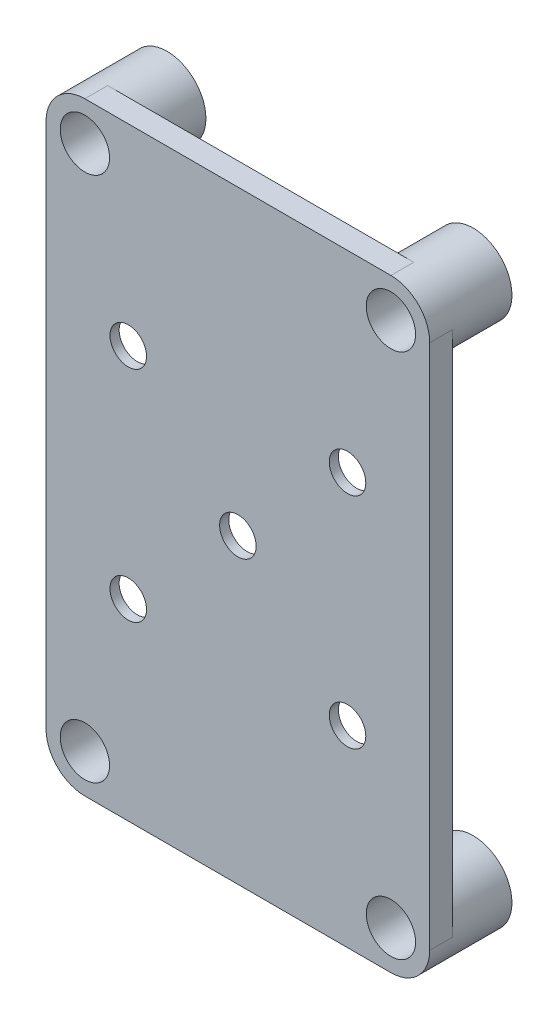
ISO-10303-21;
HEADER;
FILE_DESCRIPTION(('STEP AP214'),'2;1');
FILE_NAME('part.step','',(''),(''),'','','');
FILE_SCHEMA(('AUTOMOTIVE_DESIGN { 1 0 10303 214 1 1 1 1 }'));
ENDSEC;
DATA;
#1=APPLICATION_CONTEXT('core data for automotive mechanical design processes');
#2=APPLICATION_PROTOCOL_DEFINITION('international standard','automotive_design',2000,#1);
#3=PRODUCT_CONTEXT('',#1,'mechanical');
#4=PRODUCT('Part','Part','',(#3));
#5=PRODUCT_RELATED_PRODUCT_CATEGORY('part','',(#4));
#6=PRODUCT_DEFINITION_FORMATION('','',#4);
#7=PRODUCT_DEFINITION_CONTEXT('part definition',#1,'design');
#8=PRODUCT_DEFINITION('design','',#6,#7);
#9=PRODUCT_DEFINITION_SHAPE('','',#8);
#10=(LENGTH_UNIT() NAMED_UNIT(*) SI_UNIT(.MILLI.,.METRE.));
#11=(NAMED_UNIT(*) PLANE_ANGLE_UNIT() SI_UNIT($,.RADIAN.));
#12=(NAMED_UNIT(*) SI_UNIT($,.STERADIAN.) SOLID_ANGLE_UNIT());
#13=UNCERTAINTY_MEASURE_WITH_UNIT(LENGTH_MEASURE(1.E-05),#10,'distance_accuracy_value','');
#14=(GEOMETRIC_REPRESENTATION_CONTEXT(3) GLOBAL_UNCERTAINTY_ASSIGNED_CONTEXT((#13)) GLOBAL_UNIT_ASSIGNED_CONTEXT((#10,
#11,#12)) REPRESENTATION_CONTEXT('',''));
#15=CARTESIAN_POINT('',(0.,0.,0.));
#16=DIRECTION('',(0.,0.,1.));
#17=DIRECTION('',(1.,0.,0.));
#18=AXIS2_PLACEMENT_3D('',#15,#16,#17);
#19=CARTESIAN_POINT('',(0.,0.,0.));
#20=DIRECTION('',(0.,0.,1.));
#21=DIRECTION('',(1.,0.,0.));
#22=AXIS2_PLACEMENT_3D('',#19,#20,#21);
#23=PLANE('',#22);
#24=CARTESIAN_POINT('',(12.,12.,0.));
#25=DIRECTION('',(0.,0.,1.));
#26=DIRECTION('',(1.,0.,0.));
#27=AXIS2_PLACEMENT_3D('',#24,#25,#26);
#28=CIRCLE('',#27,4.30000000000001);
#29=CARTESIAN_POINT('',(16.3,12.,0.));
#30=VERTEX_POINT('',#29);
#31=EDGE_CURVE('E213',#30,#30,#28,.T.);
#32=ORIENTED_EDGE('',*,*,#31,.T.);
#33=EDGE_LOOP('',(#32));
#34=FACE_BOUND('',#33,.T.);
#35=CARTESIAN_POINT('',(0.,0.,0.));
#36=DIRECTION('',(0.,0.,1.));
#37=DIRECTION('',(1.,0.,0.));
#38=AXIS2_PLACEMENT_3D('',#35,#36,#37);
#39=CIRCLE('',#38,4.30000000000001);
#40=CARTESIAN_POINT('',(4.30000000000001,0.,0.));
#41=VERTEX_POINT('',#40);
#42=EDGE_CURVE('E210',#41,#41,#39,.T.);
#43=ORIENTED_EDGE('',*,*,#42,.T.);
#44=EDGE_LOOP('',(#43));
#45=FACE_BOUND('',#44,.T.);
#46=CARTESIAN_POINT('',(-12.,-12.,0.));
#47=DIRECTION('',(0.,0.,1.));
#48=DIRECTION('',(1.,0.,0.));
#49=AXIS2_PLACEMENT_3D('',#46,#47,#48);
#50=CIRCLE('',#49,4.30000000000001);
#51=CARTESIAN_POINT('',(-7.69999999999999,-12.,0.));
#52=VERTEX_POINT('',#51);
#53=EDGE_CURVE('E207',#52,#52,#50,.T.);
#54=ORIENTED_EDGE('',*,*,#53,.T.);
#55=EDGE_LOOP('',(#54));
#56=FACE_BOUND('',#55,.T.);
#57=CARTESIAN_POINT('',(-12.,12.,0.));
#58=DIRECTION('',(0.,0.,1.));
#59=DIRECTION('',(1.,0.,0.));
#60=AXIS2_PLACEMENT_3D('',#57,#58,#59);
#61=CIRCLE('',#60,4.30000000000003);
#62=CARTESIAN_POINT('',(-7.69999999999997,12.,0.));
#63=VERTEX_POINT('',#62);
#64=EDGE_CURVE('E201',#63,#63,#61,.T.);
#65=ORIENTED_EDGE('',*,*,#64,.T.);
#66=EDGE_LOOP('',(#65));
#67=FACE_BOUND('',#66,.T.);
#68=CARTESIAN_POINT('',(12.,-12.,0.));
#69=DIRECTION('',(0.,0.,1.));
#70=DIRECTION('',(1.,0.,0.));
#71=AXIS2_PLACEMENT_3D('',#68,#69,#70);
#72=CIRCLE('',#71,4.3);
#73=CARTESIAN_POINT('',(16.3,-12.,0.));
#74=VERTEX_POINT('',#73);
#75=EDGE_CURVE('E198',#74,#74,#72,.T.);
#76=ORIENTED_EDGE('',*,*,#75,.T.);
#77=EDGE_LOOP('',(#76));
#78=FACE_BOUND('',#77,.T.);
#79=DIRECTION('',(1.,0.,0.));
#80=VECTOR('',#79,1.);
#81=CARTESIAN_POINT('',(0.,33.05,0.));
#82=LINE('',#81,#80);
#83=CARTESIAN_POINT('',(-16.75,33.05,0.));
#84=VERTEX_POINT('',#83);
#85=CARTESIAN_POINT('',(16.75,33.05,0.));
#86=VERTEX_POINT('',#85);
#87=EDGE_CURVE('E168',#84,#86,#82,.T.);
#88=ORIENTED_EDGE('',*,*,#87,.T.);
#89=CARTESIAN_POINT('',(16.75,28.8,0.));
#90=DIRECTION('',(0.,0.,1.));
#91=DIRECTION('',(1.,0.,0.));
#92=AXIS2_PLACEMENT_3D('',#89,#90,#91);
#93=CIRCLE('',#92,4.25);
#94=CARTESIAN_POINT('',(21.,28.8,0.));
#95=VERTEX_POINT('',#94);
#96=EDGE_CURVE('E75',#86,#95,#93,.T.);
#97=ORIENTED_EDGE('',*,*,#96,.T.);
#98=DIRECTION('',(0.,1.,0.));
#99=VECTOR('',#98,1.);
#100=CARTESIAN_POINT('',(21.,0.,0.));
#101=LINE('',#100,#99);
#102=CARTESIAN_POINT('',(21.,-28.8,0.));
#103=VERTEX_POINT('',#102);
#104=EDGE_CURVE('E165',#103,#95,#101,.T.);
#105=ORIENTED_EDGE('',*,*,#104,.F.);
#106=CARTESIAN_POINT('',(16.75,-28.8,0.));
#107=DIRECTION('',(0.,0.,1.));
#108=DIRECTION('',(1.,0.,0.));
#109=AXIS2_PLACEMENT_3D('',#106,#107,#108);
#110=CIRCLE('',#109,4.25);
#111=CARTESIAN_POINT('',(16.75,-33.05,0.));
#112=VERTEX_POINT('',#111);
#113=EDGE_CURVE('E255',#112,#103,#110,.F.);
#114=ORIENTED_EDGE('',*,*,#113,.F.);
#115=DIRECTION('',(1.,0.,0.));
#116=VECTOR('',#115,1.);
#117=CARTESIAN_POINT('',(0.,-33.05,0.));
#118=LINE('',#117,#116);
#119=CARTESIAN_POINT('',(-16.75,-33.05,0.));
#120=VERTEX_POINT('',#119);
#121=EDGE_CURVE('E162',#120,#112,#118,.T.);
#122=ORIENTED_EDGE('',*,*,#121,.F.);
#123=CARTESIAN_POINT('',(-16.75,-28.8,0.));
#124=DIRECTION('',(0.,0.,1.));
#125=DIRECTION('',(1.,0.,0.));
#126=AXIS2_PLACEMENT_3D('',#123,#124,#125);
#127=CIRCLE('',#126,4.25);
#128=CARTESIAN_POINT('',(-21.,-28.8,0.));
#129=VERTEX_POINT('',#128);
#130=EDGE_CURVE('E272',#120,#129,#127,.T.);
#131=ORIENTED_EDGE('',*,*,#130,.T.);
#132=DIRECTION('',(0.,1.,0.));
#133=VECTOR('',#132,1.);
#134=CARTESIAN_POINT('',(-21.,0.,0.));
#135=LINE('',#134,#133);
#136=CARTESIAN_POINT('',(-21.,28.8,0.));
#137=VERTEX_POINT('',#136);
#138=EDGE_CURVE('E166',#129,#137,#135,.T.);
#139=ORIENTED_EDGE('',*,*,#138,.T.);
#140=CARTESIAN_POINT('',(-16.75,28.8,0.));
#141=DIRECTION('',(0.,0.,1.));
#142=DIRECTION('',(1.,0.,0.));
#143=AXIS2_PLACEMENT_3D('',#140,#141,#142);
#144=CIRCLE('',#143,4.25);
#145=EDGE_CURVE('E82',#84,#137,#144,.F.);
#146=ORIENTED_EDGE('',*,*,#145,.F.);
#147=EDGE_LOOP('',(#88,#97,#105,#114,#122,#131,#139,#146));
#148=FACE_BOUND('',#147,.T.);
#149=ADVANCED_FACE('F39',(#34,#45,#56,#67,#78,#148),#23,.F.);
#150=CARTESIAN_POINT('',(-21.,0.,2.5));
#151=DIRECTION('',(-1.,0.,0.));
#152=DIRECTION('',(0.,0.,1.));
#153=AXIS2_PLACEMENT_3D('',#150,#151,#152);
#154=PLANE('',#153);
#155=ORIENTED_EDGE('',*,*,#138,.F.);
#156=DIRECTION('',(0.,0.,-1.));
#157=VECTOR('',#156,1.);
#158=CARTESIAN_POINT('',(-21.,-28.8,2.5));
#159=LINE('',#158,#157);
#160=CARTESIAN_POINT('',(-21.,-28.8,2.5));
#161=VERTEX_POINT('',#160);
#162=EDGE_CURVE('E90',#161,#129,#159,.T.);
#163=ORIENTED_EDGE('',*,*,#162,.F.);
#164=DIRECTION('',(0.,1.,0.));
#165=VECTOR('',#164,1.);
#166=CARTESIAN_POINT('',(-21.,0.,2.5));
#167=LINE('',#166,#165);
#168=CARTESIAN_POINT('',(-21.,28.8,2.5));
#169=VERTEX_POINT('',#168);
#170=EDGE_CURVE('E193',#161,#169,#167,.T.);
#171=ORIENTED_EDGE('',*,*,#170,.T.);
#172=DIRECTION('',(0.,0.,-1.));
#173=VECTOR('',#172,1.);
#174=CARTESIAN_POINT('',(-21.,28.8,2.5));
#175=LINE('',#174,#173);
#176=EDGE_CURVE('E56',#169,#137,#175,.T.);
#177=ORIENTED_EDGE('',*,*,#176,.T.);
#178=EDGE_LOOP('',(#155,#163,#171,#177));
#179=FACE_BOUND('',#178,.T.);
#180=ADVANCED_FACE('F232',(#179),#154,.T.);
#181=CARTESIAN_POINT('',(-16.75,-28.8,2.5));
#182=DIRECTION('',(0.,0.,-1.));
#183=DIRECTION('',(-1.,0.,0.));
#184=AXIS2_PLACEMENT_3D('',#181,#182,#183);
#185=CYLINDRICAL_SURFACE('',#184,4.25);
#186=ORIENTED_EDGE('',*,*,#162,.T.);
#187=ORIENTED_EDGE('',*,*,#130,.F.);
#188=DIRECTION('',(0.,0.,-1.));
#189=VECTOR('',#188,1.);
#190=CARTESIAN_POINT('',(-16.75,-33.05,2.5));
#191=LINE('',#190,#189);
#192=CARTESIAN_POINT('',(-16.75,-33.05,2.5));
#193=VERTEX_POINT('',#192);
#194=EDGE_CURVE('E176',#193,#120,#191,.T.);
#195=ORIENTED_EDGE('',*,*,#194,.F.);
#196=CARTESIAN_POINT('',(-16.75,-28.8,2.5));
#197=DIRECTION('',(0.,0.,1.));
#198=DIRECTION('',(1.,0.,0.));
#199=AXIS2_PLACEMENT_3D('',#196,#197,#198);
#200=CIRCLE('',#199,4.25);
#201=EDGE_CURVE('E284',#161,#193,#200,.T.);
#202=ORIENTED_EDGE('',*,*,#201,.F.);
#203=EDGE_LOOP('',(#186,#187,#195,#202));
#204=FACE_BOUND('',#203,.T.);
#205=CARTESIAN_POINT('',(-16.75,-28.8,-6.5));
#206=DIRECTION('',(0.,0.,1.));
#207=DIRECTION('',(1.,0.,0.));
#208=AXIS2_PLACEMENT_3D('',#205,#206,#207);
#209=CIRCLE('',#208,4.25);
#210=CARTESIAN_POINT('',(-12.5,-28.8,-6.5));
#211=VERTEX_POINT('',#210);
#212=EDGE_CURVE('E271',#211,#211,#209,.T.);
#213=ORIENTED_EDGE('',*,*,#212,.T.);
#214=EDGE_LOOP('',(#213));
#215=FACE_BOUND('',#214,.T.);
#216=ADVANCED_FACE('F295',(#204,#215),#185,.T.);
#217=CARTESIAN_POINT('',(0.,-33.05,2.5));
#218=DIRECTION('',(0.,1.,0.));
#219=DIRECTION('',(0.,0.,1.));
#220=AXIS2_PLACEMENT_3D('',#217,#218,#219);
#221=PLANE('',#220);
#222=ORIENTED_EDGE('',*,*,#121,.T.);
#223=DIRECTION('',(0.,0.,-1.));
#224=VECTOR('',#223,1.);
#225=CARTESIAN_POINT('',(16.75,-33.05,2.5));
#226=LINE('',#225,#224);
#227=CARTESIAN_POINT('',(16.75,-33.05,2.5));
#228=VERTEX_POINT('',#227);
#229=EDGE_CURVE('E173',#228,#112,#226,.T.);
#230=ORIENTED_EDGE('',*,*,#229,.F.);
#231=DIRECTION('',(1.,0.,0.));
#232=VECTOR('',#231,1.);
#233=CARTESIAN_POINT('',(0.,-33.05,2.5));
#234=LINE('',#233,#232);
#235=EDGE_CURVE('E286',#193,#228,#234,.T.);
#236=ORIENTED_EDGE('',*,*,#235,.F.);
#237=ORIENTED_EDGE('',*,*,#194,.T.);
#238=EDGE_LOOP('',(#222,#230,#236,#237));
#239=FACE_BOUND('',#238,.T.);
#240=ADVANCED_FACE('F291',(#239),#221,.F.);
#241=CARTESIAN_POINT('',(16.75,-28.8,2.5));
#242=DIRECTION('',(0.,0.,-1.));
#243=DIRECTION('',(-1.,0.,0.));
#244=AXIS2_PLACEMENT_3D('',#241,#242,#243);
#245=CYLINDRICAL_SURFACE('',#244,4.25);
#246=ORIENTED_EDGE('',*,*,#229,.T.);
#247=ORIENTED_EDGE('',*,*,#113,.T.);
#248=DIRECTION('',(0.,0.,-1.));
#249=VECTOR('',#248,1.);
#250=CARTESIAN_POINT('',(21.,-28.8,2.5));
#251=LINE('',#250,#249);
#252=CARTESIAN_POINT('',(21.,-28.8,2.5));
#253=VERTEX_POINT('',#252);
#254=EDGE_CURVE('E171',#253,#103,#251,.T.);
#255=ORIENTED_EDGE('',*,*,#254,.F.);
#256=CARTESIAN_POINT('',(16.75,-28.8,2.5));
#257=DIRECTION('',(0.,0.,1.));
#258=DIRECTION('',(1.,0.,0.));
#259=AXIS2_PLACEMENT_3D('',#256,#257,#258);
#260=CIRCLE('',#259,4.25);
#261=EDGE_CURVE('E254',#253,#228,#260,.F.);
#262=ORIENTED_EDGE('',*,*,#261,.T.);
#263=EDGE_LOOP('',(#246,#247,#255,#262));
#264=FACE_BOUND('',#263,.T.);
#265=CARTESIAN_POINT('',(16.75,-28.8,-6.5));
#266=DIRECTION('',(0.,0.,1.));
#267=DIRECTION('',(1.,0.,0.));
#268=AXIS2_PLACEMENT_3D('',#265,#266,#267);
#269=CIRCLE('',#268,4.25);
#270=CARTESIAN_POINT('',(21.,-28.8,-6.5));
#271=VERTEX_POINT('',#270);
#272=EDGE_CURVE('E258',#271,#271,#269,.F.);
#273=ORIENTED_EDGE('',*,*,#272,.F.);
#274=EDGE_LOOP('',(#273));
#275=FACE_BOUND('',#274,.T.);
#276=ADVANCED_FACE('F252',(#264,#275),#245,.T.);
#277=CARTESIAN_POINT('',(21.,0.,2.5));
#278=DIRECTION('',(-1.,0.,0.));
#279=DIRECTION('',(0.,0.,1.));
#280=AXIS2_PLACEMENT_3D('',#277,#278,#279);
#281=PLANE('',#280);
#282=ORIENTED_EDGE('',*,*,#104,.T.);
#283=DIRECTION('',(0.,0.,-1.));
#284=VECTOR('',#283,1.);
#285=CARTESIAN_POINT('',(21.,28.8,2.5));
#286=LINE('',#285,#284);
#287=CARTESIAN_POINT('',(21.,28.8,2.5));
#288=VERTEX_POINT('',#287);
#289=EDGE_CURVE('E126',#288,#95,#286,.T.);
#290=ORIENTED_EDGE('',*,*,#289,.F.);
#291=DIRECTION('',(0.,1.,0.));
#292=VECTOR('',#291,1.);
#293=CARTESIAN_POINT('',(21.,0.,2.5));
#294=LINE('',#293,#292);
#295=EDGE_CURVE('E118',#253,#288,#294,.T.);
#296=ORIENTED_EDGE('',*,*,#295,.F.);
#297=ORIENTED_EDGE('',*,*,#254,.T.);
#298=EDGE_LOOP('',(#282,#290,#296,#297));
#299=FACE_BOUND('',#298,.T.);
#300=ADVANCED_FACE('F249',(#299),#281,.F.);
#301=CARTESIAN_POINT('',(16.75,28.8,2.5));
#302=DIRECTION('',(0.,0.,-1.));
#303=DIRECTION('',(-1.,0.,0.));
#304=AXIS2_PLACEMENT_3D('',#301,#302,#303);
#305=CYLINDRICAL_SURFACE('',#304,4.25);
#306=ORIENTED_EDGE('',*,*,#289,.T.);
#307=ORIENTED_EDGE('',*,*,#96,.F.);
#308=DIRECTION('',(0.,0.,-1.));
#309=VECTOR('',#308,1.);
#310=CARTESIAN_POINT('',(16.75,33.05,2.5));
#311=LINE('',#310,#309);
#312=CARTESIAN_POINT('',(16.75,33.05,2.5));
#313=VERTEX_POINT('',#312);
#314=EDGE_CURVE('E121',#313,#86,#311,.T.);
#315=ORIENTED_EDGE('',*,*,#314,.F.);
#316=CARTESIAN_POINT('',(16.75,28.8,2.5));
#317=DIRECTION('',(0.,0.,1.));
#318=DIRECTION('',(1.,0.,0.));
#319=AXIS2_PLACEMENT_3D('',#316,#317,#318);
#320=CIRCLE('',#319,4.25);
#321=EDGE_CURVE('E109',#288,#313,#320,.T.);
#322=ORIENTED_EDGE('',*,*,#321,.F.);
#323=EDGE_LOOP('',(#306,#307,#315,#322));
#324=FACE_BOUND('',#323,.T.);
#325=CARTESIAN_POINT('',(16.75,28.8,-6.5));
#326=DIRECTION('',(0.,0.,1.));
#327=DIRECTION('',(1.,0.,0.));
#328=AXIS2_PLACEMENT_3D('',#325,#326,#327);
#329=CIRCLE('',#328,4.25);
#330=CARTESIAN_POINT('',(21.,28.8,-6.5));
#331=VERTEX_POINT('',#330);
#332=EDGE_CURVE('E259',#331,#331,#329,.T.);
#333=ORIENTED_EDGE('',*,*,#332,.T.);
#334=EDGE_LOOP('',(#333));
#335=FACE_BOUND('',#334,.T.);
#336=ADVANCED_FACE('F122',(#324,#335),#305,.T.);
#337=CARTESIAN_POINT('',(0.,33.05,2.5));
#338=DIRECTION('',(0.,1.,0.));
#339=DIRECTION('',(0.,0.,1.));
#340=AXIS2_PLACEMENT_3D('',#337,#338,#339);
#341=PLANE('',#340);
#342=ORIENTED_EDGE('',*,*,#87,.F.);
#343=DIRECTION('',(0.,0.,-1.));
#344=VECTOR('',#343,1.);
#345=CARTESIAN_POINT('',(-16.75,33.05,2.5));
#346=LINE('',#345,#344);
#347=CARTESIAN_POINT('',(-16.75,33.05,2.5));
#348=VERTEX_POINT('',#347);
#349=EDGE_CURVE('E127',#348,#84,#346,.T.);
#350=ORIENTED_EDGE('',*,*,#349,.F.);
#351=DIRECTION('',(1.,0.,0.));
#352=VECTOR('',#351,1.);
#353=CARTESIAN_POINT('',(0.,33.05,2.5));
#354=LINE('',#353,#352);
#355=EDGE_CURVE('E115',#348,#313,#354,.T.);
#356=ORIENTED_EDGE('',*,*,#355,.T.);
#357=ORIENTED_EDGE('',*,*,#314,.T.);
#358=EDGE_LOOP('',(#342,#350,#356,#357));
#359=FACE_BOUND('',#358,.T.);
#360=ADVANCED_FACE('F129',(#359),#341,.T.);
#361=CARTESIAN_POINT('',(-16.75,-28.8,2.5));
#362=DIRECTION('',(0.,0.,-1.));
#363=DIRECTION('',(-1.,0.,0.));
#364=AXIS2_PLACEMENT_3D('',#361,#362,#363);
#365=CYLINDRICAL_SURFACE('',#364,2.69999999999984);
#366=CARTESIAN_POINT('',(-16.75,-28.8,2.5));
#367=DIRECTION('',(0.,0.,1.));
#368=DIRECTION('',(1.,0.,0.));
#369=AXIS2_PLACEMENT_3D('',#366,#367,#368);
#370=CIRCLE('',#369,2.69999999999984);
#371=CARTESIAN_POINT('',(-14.0500000000002,-28.8,2.5));
#372=VERTEX_POINT('',#371);
#373=EDGE_CURVE('E156',#372,#372,#370,.T.);
#374=ORIENTED_EDGE('',*,*,#373,.T.);
#375=EDGE_LOOP('',(#374));
#376=FACE_BOUND('',#375,.T.);
#377=CARTESIAN_POINT('',(-16.75,-28.8,-6.5));
#378=DIRECTION('',(0.,0.,1.));
#379=DIRECTION('',(1.,0.,0.));
#380=AXIS2_PLACEMENT_3D('',#377,#378,#379);
#381=CIRCLE('',#380,2.69999999999984);
#382=CARTESIAN_POINT('',(-14.0500000000002,-28.8,-6.5));
#383=VERTEX_POINT('',#382);
#384=EDGE_CURVE('E268',#383,#383,#381,.T.);
#385=ORIENTED_EDGE('',*,*,#384,.F.);
#386=EDGE_LOOP('',(#385));
#387=FACE_BOUND('',#386,.T.);
#388=ADVANCED_FACE('F321',(#376,#387),#365,.F.);
#389=CARTESIAN_POINT('',(16.75,-28.8,2.5));
#390=DIRECTION('',(0.,0.,-1.));
#391=DIRECTION('',(-1.,0.,0.));
#392=AXIS2_PLACEMENT_3D('',#389,#390,#391);
#393=CYLINDRICAL_SURFACE('',#392,2.7);
#394=CARTESIAN_POINT('',(16.75,-28.8,2.5));
#395=DIRECTION('',(0.,0.,1.));
#396=DIRECTION('',(1.,0.,0.));
#397=AXIS2_PLACEMENT_3D('',#394,#395,#396);
#398=CIRCLE('',#397,2.7);
#399=CARTESIAN_POINT('',(19.45,-28.8,2.5));
#400=VERTEX_POINT('',#399);
#401=EDGE_CURVE('E153',#400,#400,#398,.F.);
#402=ORIENTED_EDGE('',*,*,#401,.F.);
#403=EDGE_LOOP('',(#402));
#404=FACE_BOUND('',#403,.T.);
#405=CARTESIAN_POINT('',(16.75,-28.8,-6.5));
#406=DIRECTION('',(0.,0.,1.));
#407=DIRECTION('',(1.,0.,0.));
#408=AXIS2_PLACEMENT_3D('',#405,#406,#407);
#409=CIRCLE('',#408,2.7);
#410=CARTESIAN_POINT('',(19.45,-28.8,-6.5));
#411=VERTEX_POINT('',#410);
#412=EDGE_CURVE('E262',#411,#411,#409,.F.);
#413=ORIENTED_EDGE('',*,*,#412,.T.);
#414=EDGE_LOOP('',(#413));
#415=FACE_BOUND('',#414,.T.);
#416=ADVANCED_FACE('F324',(#404,#415),#393,.F.);
#417=CARTESIAN_POINT('',(0.,0.,2.5));
#418=DIRECTION('',(0.,0.,-1.));
#419=DIRECTION('',(-1.,0.,0.));
#420=AXIS2_PLACEMENT_3D('',#417,#418,#419);
#421=CYLINDRICAL_SURFACE('',#420,2.);
#422=CARTESIAN_POINT('',(0.,0.,1.5));
#423=DIRECTION('',(0.,0.,1.));
#424=DIRECTION('',(1.,0.,0.));
#425=AXIS2_PLACEMENT_3D('',#422,#423,#424);
#426=CIRCLE('',#425,2.);
#427=CARTESIAN_POINT('',(2.,0.,1.5));
#428=VERTEX_POINT('',#427);
#429=EDGE_CURVE('E48',#428,#428,#426,.F.);
#430=ORIENTED_EDGE('',*,*,#429,.T.);
#431=EDGE_LOOP('',(#430));
#432=FACE_BOUND('',#431,.T.);
#433=CARTESIAN_POINT('',(0.,0.,2.5));
#434=DIRECTION('',(0.,0.,1.));
#435=DIRECTION('',(1.,0.,0.));
#436=AXIS2_PLACEMENT_3D('',#433,#434,#435);
#437=CIRCLE('',#436,2.);
#438=CARTESIAN_POINT('',(2.,0.,2.5));
#439=VERTEX_POINT('',#438);
#440=EDGE_CURVE('E150',#439,#439,#437,.T.);
#441=ORIENTED_EDGE('',*,*,#440,.T.);
#442=EDGE_LOOP('',(#441));
#443=FACE_BOUND('',#442,.T.);
#444=ADVANCED_FACE('F221',(#432,#443),#421,.F.);
#445=CARTESIAN_POINT('',(-12.,12.,2.5));
#446=DIRECTION('',(0.,0.,-1.));
#447=DIRECTION('',(-1.,0.,0.));
#448=AXIS2_PLACEMENT_3D('',#445,#446,#447);
#449=CYLINDRICAL_SURFACE('',#448,2.);
#450=CARTESIAN_POINT('',(-12.,12.,1.50000000000001));
#451=DIRECTION('',(0.,0.,1.));
#452=DIRECTION('',(1.,0.,0.));
#453=AXIS2_PLACEMENT_3D('',#450,#451,#452);
#454=CIRCLE('',#453,2.);
#455=CARTESIAN_POINT('',(-10.,12.,1.50000000000001));
#456=VERTEX_POINT('',#455);
#457=EDGE_CURVE('E186',#456,#456,#454,.F.);
#458=ORIENTED_EDGE('',*,*,#457,.T.);
#459=EDGE_LOOP('',(#458));
#460=FACE_BOUND('',#459,.T.);
#461=CARTESIAN_POINT('',(-12.,12.,2.5));
#462=DIRECTION('',(0.,0.,1.));
#463=DIRECTION('',(1.,0.,0.));
#464=AXIS2_PLACEMENT_3D('',#461,#462,#463);
#465=CIRCLE('',#464,2.);
#466=CARTESIAN_POINT('',(-10.,12.,2.5));
#467=VERTEX_POINT('',#466);
#468=EDGE_CURVE('E147',#467,#467,#465,.F.);
#469=ORIENTED_EDGE('',*,*,#468,.F.);
#470=EDGE_LOOP('',(#469));
#471=FACE_BOUND('',#470,.T.);
#472=ADVANCED_FACE('F331',(#460,#471),#449,.F.);
#473=CARTESIAN_POINT('',(-12.,-12.,2.5));
#474=DIRECTION('',(0.,0.,-1.));
#475=DIRECTION('',(-1.,0.,0.));
#476=AXIS2_PLACEMENT_3D('',#473,#474,#475);
#477=CYLINDRICAL_SURFACE('',#476,2.);
#478=CARTESIAN_POINT('',(-12.,-12.,1.5));
#479=DIRECTION('',(0.,0.,1.));
#480=DIRECTION('',(1.,0.,0.));
#481=AXIS2_PLACEMENT_3D('',#478,#479,#480);
#482=CIRCLE('',#481,2.);
#483=CARTESIAN_POINT('',(-10.,-12.,1.5));
#484=VERTEX_POINT('',#483);
#485=EDGE_CURVE('E11',#484,#484,#482,.F.);
#486=ORIENTED_EDGE('',*,*,#485,.T.);
#487=EDGE_LOOP('',(#486));
#488=FACE_BOUND('',#487,.T.);
#489=CARTESIAN_POINT('',(-12.,-12.,2.5));
#490=DIRECTION('',(0.,0.,1.));
#491=DIRECTION('',(1.,0.,0.));
#492=AXIS2_PLACEMENT_3D('',#489,#490,#491);
#493=CIRCLE('',#492,2.);
#494=CARTESIAN_POINT('',(-10.,-12.,2.5));
#495=VERTEX_POINT('',#494);
#496=EDGE_CURVE('E144',#495,#495,#493,.T.);
#497=ORIENTED_EDGE('',*,*,#496,.T.);
#498=EDGE_LOOP('',(#497));
#499=FACE_BOUND('',#498,.T.);
#500=ADVANCED_FACE('F334',(#488,#499),#477,.F.);
#501=CARTESIAN_POINT('',(12.,-12.,2.5));
#502=DIRECTION('',(0.,0.,-1.));
#503=DIRECTION('',(-1.,0.,0.));
#504=AXIS2_PLACEMENT_3D('',#501,#502,#503);
#505=CYLINDRICAL_SURFACE('',#504,2.);
#506=CARTESIAN_POINT('',(12.,-12.,1.5));
#507=DIRECTION('',(0.,0.,1.));
#508=DIRECTION('',(1.,0.,0.));
#509=AXIS2_PLACEMENT_3D('',#506,#507,#508);
#510=CIRCLE('',#509,2.);
#511=CARTESIAN_POINT('',(14.,-12.,1.5));
#512=VERTEX_POINT('',#511);
#513=EDGE_CURVE('E204',#512,#512,#510,.F.);
#514=ORIENTED_EDGE('',*,*,#513,.T.);
#515=EDGE_LOOP('',(#514));
#516=FACE_BOUND('',#515,.T.);
#517=CARTESIAN_POINT('',(12.,-12.,2.5));
#518=DIRECTION('',(0.,0.,1.));
#519=DIRECTION('',(1.,0.,0.));
#520=AXIS2_PLACEMENT_3D('',#517,#518,#519);
#521=CIRCLE('',#520,2.);
#522=CARTESIAN_POINT('',(14.,-12.,2.5));
#523=VERTEX_POINT('',#522);
#524=EDGE_CURVE('E141',#523,#523,#521,.F.);
#525=ORIENTED_EDGE('',*,*,#524,.F.);
#526=EDGE_LOOP('',(#525));
#527=FACE_BOUND('',#526,.T.);
#528=ADVANCED_FACE('F338',(#516,#527),#505,.F.);
#529=CARTESIAN_POINT('',(12.,12.,2.5));
#530=DIRECTION('',(0.,0.,-1.));
#531=DIRECTION('',(-1.,0.,0.));
#532=AXIS2_PLACEMENT_3D('',#529,#530,#531);
#533=CYLINDRICAL_SURFACE('',#532,2.);
#534=CARTESIAN_POINT('',(12.,12.,1.5));
#535=DIRECTION('',(0.,0.,1.));
#536=DIRECTION('',(1.,0.,0.));
#537=AXIS2_PLACEMENT_3D('',#534,#535,#536);
#538=CIRCLE('',#537,2.);
#539=CARTESIAN_POINT('',(14.,12.,1.5));
#540=VERTEX_POINT('',#539);
#541=EDGE_CURVE('E216',#540,#540,#538,.F.);
#542=ORIENTED_EDGE('',*,*,#541,.T.);
#543=EDGE_LOOP('',(#542));
#544=FACE_BOUND('',#543,.T.);
#545=CARTESIAN_POINT('',(12.,12.,2.5));
#546=DIRECTION('',(0.,0.,1.));
#547=DIRECTION('',(1.,0.,0.));
#548=AXIS2_PLACEMENT_3D('',#545,#546,#547);
#549=CIRCLE('',#548,2.);
#550=CARTESIAN_POINT('',(14.,12.,2.5));
#551=VERTEX_POINT('',#550);
#552=EDGE_CURVE('E138',#551,#551,#549,.T.);
#553=ORIENTED_EDGE('',*,*,#552,.T.);
#554=EDGE_LOOP('',(#553));
#555=FACE_BOUND('',#554,.T.);
#556=ADVANCED_FACE('F342',(#544,#555),#533,.F.);
#557=CARTESIAN_POINT('',(16.75,28.8,2.5));
#558=DIRECTION('',(0.,0.,-1.));
#559=DIRECTION('',(-1.,0.,0.));
#560=AXIS2_PLACEMENT_3D('',#557,#558,#559);
#561=CYLINDRICAL_SURFACE('',#560,2.7);
#562=CARTESIAN_POINT('',(16.75,28.8,2.5));
#563=DIRECTION('',(0.,0.,1.));
#564=DIRECTION('',(1.,0.,0.));
#565=AXIS2_PLACEMENT_3D('',#562,#563,#564);
#566=CIRCLE('',#565,2.7);
#567=CARTESIAN_POINT('',(19.45,28.8,2.5));
#568=VERTEX_POINT('',#567);
#569=EDGE_CURVE('E132',#568,#568,#566,.T.);
#570=ORIENTED_EDGE('',*,*,#569,.T.);
#571=EDGE_LOOP('',(#570));
#572=FACE_BOUND('',#571,.T.);
#573=CARTESIAN_POINT('',(16.75,28.8,-6.5));
#574=DIRECTION('',(0.,0.,1.));
#575=DIRECTION('',(1.,0.,0.));
#576=AXIS2_PLACEMENT_3D('',#573,#574,#575);
#577=CIRCLE('',#576,2.7);
#578=CARTESIAN_POINT('',(19.45,28.8,-6.5));
#579=VERTEX_POINT('',#578);
#580=EDGE_CURVE('E246',#579,#579,#577,.T.);
#581=ORIENTED_EDGE('',*,*,#580,.F.);
#582=EDGE_LOOP('',(#581));
#583=FACE_BOUND('',#582,.T.);
#584=ADVANCED_FACE('F301',(#572,#583),#561,.F.);
#585=CARTESIAN_POINT('',(-16.75,28.8,2.5));
#586=DIRECTION('',(0.,0.,-1.));
#587=DIRECTION('',(-1.,0.,0.));
#588=AXIS2_PLACEMENT_3D('',#585,#586,#587);
#589=CYLINDRICAL_SURFACE('',#588,4.25);
#590=ORIENTED_EDGE('',*,*,#349,.T.);
#591=ORIENTED_EDGE('',*,*,#145,.T.);
#592=ORIENTED_EDGE('',*,*,#176,.F.);
#593=CARTESIAN_POINT('',(-16.75,28.8,2.5));
#594=DIRECTION('',(0.,0.,1.));
#595=DIRECTION('',(1.,0.,0.));
#596=AXIS2_PLACEMENT_3D('',#593,#594,#595);
#597=CIRCLE('',#596,4.25);
#598=EDGE_CURVE('E130',#169,#348,#597,.F.);
#599=ORIENTED_EDGE('',*,*,#598,.T.);
#600=EDGE_LOOP('',(#590,#591,#592,#599));
#601=FACE_BOUND('',#600,.T.);
#602=CARTESIAN_POINT('',(-16.75,28.8,-6.5));
#603=DIRECTION('',(0.,0.,1.));
#604=DIRECTION('',(1.,0.,0.));
#605=AXIS2_PLACEMENT_3D('',#602,#603,#604);
#606=CIRCLE('',#605,4.25);
#607=CARTESIAN_POINT('',(-12.5,28.8,-6.5));
#608=VERTEX_POINT('',#607);
#609=EDGE_CURVE('E275',#608,#608,#606,.F.);
#610=ORIENTED_EDGE('',*,*,#609,.F.);
#611=EDGE_LOOP('',(#610));
#612=FACE_BOUND('',#611,.T.);
#613=ADVANCED_FACE('F297',(#601,#612),#589,.T.);
#614=CARTESIAN_POINT('',(-16.75,28.8,2.5));
#615=DIRECTION('',(0.,0.,-1.));
#616=DIRECTION('',(-1.,0.,0.));
#617=AXIS2_PLACEMENT_3D('',#614,#615,#616);
#618=CYLINDRICAL_SURFACE('',#617,2.70000000000016);
#619=CARTESIAN_POINT('',(-16.75,28.8,2.5));
#620=DIRECTION('',(0.,0.,1.));
#621=DIRECTION('',(1.,0.,0.));
#622=AXIS2_PLACEMENT_3D('',#619,#620,#621);
#623=CIRCLE('',#622,2.70000000000016);
#624=CARTESIAN_POINT('',(-14.0499999999998,28.8,2.5));
#625=VERTEX_POINT('',#624);
#626=EDGE_CURVE('E159',#625,#625,#623,.F.);
#627=ORIENTED_EDGE('',*,*,#626,.F.);
#628=EDGE_LOOP('',(#627));
#629=FACE_BOUND('',#628,.T.);
#630=CARTESIAN_POINT('',(-16.75,28.8,-6.5));
#631=DIRECTION('',(0.,0.,1.));
#632=DIRECTION('',(1.,0.,0.));
#633=AXIS2_PLACEMENT_3D('',#630,#631,#632);
#634=CIRCLE('',#633,2.70000000000016);
#635=CARTESIAN_POINT('',(-14.0499999999998,28.8,-6.5));
#636=VERTEX_POINT('',#635);
#637=EDGE_CURVE('E280',#636,#636,#634,.F.);
#638=ORIENTED_EDGE('',*,*,#637,.T.);
#639=EDGE_LOOP('',(#638));
#640=FACE_BOUND('',#639,.T.);
#641=ADVANCED_FACE('F300',(#629,#640),#618,.F.);
#642=CARTESIAN_POINT('',(0.,0.,2.5));
#643=DIRECTION('',(0.,0.,1.));
#644=DIRECTION('',(1.,0.,0.));
#645=AXIS2_PLACEMENT_3D('',#642,#643,#644);
#646=PLANE('',#645);
#647=ORIENTED_EDGE('',*,*,#170,.F.);
#648=ORIENTED_EDGE('',*,*,#201,.T.);
#649=ORIENTED_EDGE('',*,*,#235,.T.);
#650=ORIENTED_EDGE('',*,*,#261,.F.);
#651=ORIENTED_EDGE('',*,*,#295,.T.);
#652=ORIENTED_EDGE('',*,*,#321,.T.);
#653=ORIENTED_EDGE('',*,*,#355,.F.);
#654=ORIENTED_EDGE('',*,*,#598,.F.);
#655=EDGE_LOOP('',(#647,#648,#649,#650,#651,#652,#653,#654));
#656=FACE_BOUND('',#655,.T.);
#657=ORIENTED_EDGE('',*,*,#569,.F.);
#658=EDGE_LOOP('',(#657));
#659=FACE_BOUND('',#658,.T.);
#660=ORIENTED_EDGE('',*,*,#552,.F.);
#661=EDGE_LOOP('',(#660));
#662=FACE_BOUND('',#661,.T.);
#663=ORIENTED_EDGE('',*,*,#524,.T.);
#664=EDGE_LOOP('',(#663));
#665=FACE_BOUND('',#664,.T.);
#666=ORIENTED_EDGE('',*,*,#496,.F.);
#667=EDGE_LOOP('',(#666));
#668=FACE_BOUND('',#667,.T.);
#669=ORIENTED_EDGE('',*,*,#468,.T.);
#670=EDGE_LOOP('',(#669));
#671=FACE_BOUND('',#670,.T.);
#672=ORIENTED_EDGE('',*,*,#440,.F.);
#673=EDGE_LOOP('',(#672));
#674=FACE_BOUND('',#673,.T.);
#675=ORIENTED_EDGE('',*,*,#401,.T.);
#676=EDGE_LOOP('',(#675));
#677=FACE_BOUND('',#676,.T.);
#678=ORIENTED_EDGE('',*,*,#373,.F.);
#679=EDGE_LOOP('',(#678));
#680=FACE_BOUND('',#679,.T.);
#681=ORIENTED_EDGE('',*,*,#626,.T.);
#682=EDGE_LOOP('',(#681));
#683=FACE_BOUND('',#682,.T.);
#684=ADVANCED_FACE('F111',(#656,#659,#662,#665,#668,#671,#674,#677,#680,#683),#646,.T.);
#685=CARTESIAN_POINT('',(0.,0.,-6.5));
#686=DIRECTION('',(0.,0.,1.));
#687=DIRECTION('',(1.,0.,0.));
#688=AXIS2_PLACEMENT_3D('',#685,#686,#687);
#689=PLANE('',#688);
#690=ORIENTED_EDGE('',*,*,#609,.T.);
#691=EDGE_LOOP('',(#690));
#692=FACE_BOUND('',#691,.T.);
#693=ORIENTED_EDGE('',*,*,#637,.F.);
#694=EDGE_LOOP('',(#693));
#695=FACE_BOUND('',#694,.T.);
#696=ADVANCED_FACE('F305',(#692,#695),#689,.F.);
#697=CARTESIAN_POINT('',(0.,0.,-6.5));
#698=DIRECTION('',(0.,0.,1.));
#699=DIRECTION('',(1.,0.,0.));
#700=AXIS2_PLACEMENT_3D('',#697,#698,#699);
#701=PLANE('',#700);
#702=ORIENTED_EDGE('',*,*,#384,.T.);
#703=EDGE_LOOP('',(#702));
#704=FACE_BOUND('',#703,.T.);
#705=ORIENTED_EDGE('',*,*,#212,.F.);
#706=EDGE_LOOP('',(#705));
#707=FACE_BOUND('',#706,.T.);
#708=ADVANCED_FACE('F308',(#704,#707),#701,.F.);
#709=CARTESIAN_POINT('',(0.,0.,-6.5));
#710=DIRECTION('',(0.,0.,1.));
#711=DIRECTION('',(1.,0.,0.));
#712=AXIS2_PLACEMENT_3D('',#709,#710,#711);
#713=PLANE('',#712);
#714=ORIENTED_EDGE('',*,*,#272,.T.);
#715=EDGE_LOOP('',(#714));
#716=FACE_BOUND('',#715,.T.);
#717=ORIENTED_EDGE('',*,*,#412,.F.);
#718=EDGE_LOOP('',(#717));
#719=FACE_BOUND('',#718,.T.);
#720=ADVANCED_FACE('F401',(#716,#719),#713,.F.);
#721=CARTESIAN_POINT('',(0.,0.,-6.5));
#722=DIRECTION('',(0.,0.,1.));
#723=DIRECTION('',(1.,0.,0.));
#724=AXIS2_PLACEMENT_3D('',#721,#722,#723);
#725=PLANE('',#724);
#726=ORIENTED_EDGE('',*,*,#580,.T.);
#727=EDGE_LOOP('',(#726));
#728=FACE_BOUND('',#727,.T.);
#729=ORIENTED_EDGE('',*,*,#332,.F.);
#730=EDGE_LOOP('',(#729));
#731=FACE_BOUND('',#730,.T.);
#732=ADVANCED_FACE('F368',(#728,#731),#725,.F.);
#733=CARTESIAN_POINT('',(-12.,12.,1.50000000000001));
#734=DIRECTION('',(0.,0.,-1.));
#735=DIRECTION('',(-1.,0.,0.));
#736=AXIS2_PLACEMENT_3D('',#733,#734,#735);
#737=CONICAL_SURFACE('',#736,2.,0.992894389832653);
#738=ORIENTED_EDGE('',*,*,#64,.F.);
#739=EDGE_LOOP('',(#738));
#740=FACE_BOUND('',#739,.T.);
#741=ORIENTED_EDGE('',*,*,#457,.F.);
#742=EDGE_LOOP('',(#741));
#743=FACE_BOUND('',#742,.T.);
#744=ADVANCED_FACE('F364',(#740,#743),#737,.F.);
#745=CARTESIAN_POINT('',(12.,-12.,1.5));
#746=DIRECTION('',(0.,0.,-1.));
#747=DIRECTION('',(-1.,0.,0.));
#748=AXIS2_PLACEMENT_3D('',#745,#746,#747);
#749=CONICAL_SURFACE('',#748,2.,0.99289438983265);
#750=ORIENTED_EDGE('',*,*,#75,.F.);
#751=EDGE_LOOP('',(#750));
#752=FACE_BOUND('',#751,.T.);
#753=ORIENTED_EDGE('',*,*,#513,.F.);
#754=EDGE_LOOP('',(#753));
#755=FACE_BOUND('',#754,.T.);
#756=ADVANCED_FACE('F367',(#752,#755),#749,.F.);
#757=CARTESIAN_POINT('',(12.,12.,0.));
#758=DIRECTION('',(0.,0.,-1.));
#759=DIRECTION('',(-1.,0.,0.));
#760=AXIS2_PLACEMENT_3D('',#757,#758,#759);
#761=CONICAL_SURFACE('',#760,4.30000000000001,0.992894389832653);
#762=ORIENTED_EDGE('',*,*,#541,.F.);
#763=EDGE_LOOP('',(#762));
#764=FACE_BOUND('',#763,.T.);
#765=ORIENTED_EDGE('',*,*,#31,.F.);
#766=EDGE_LOOP('',(#765));
#767=FACE_BOUND('',#766,.T.);
#768=ADVANCED_FACE('F227',(#764,#767),#761,.F.);
#769=CARTESIAN_POINT('',(0.,0.,0.));
#770=DIRECTION('',(0.,0.,-1.));
#771=DIRECTION('',(-1.,0.,0.));
#772=AXIS2_PLACEMENT_3D('',#769,#770,#771);
#773=CONICAL_SURFACE('',#772,4.30000000000001,0.992894389832653);
#774=ORIENTED_EDGE('',*,*,#429,.F.);
#775=EDGE_LOOP('',(#774));
#776=FACE_BOUND('',#775,.T.);
#777=ORIENTED_EDGE('',*,*,#42,.F.);
#778=EDGE_LOOP('',(#777));
#779=FACE_BOUND('',#778,.T.);
#780=ADVANCED_FACE('F224',(#776,#779),#773,.F.);
#781=CARTESIAN_POINT('',(-12.,-12.,0.));
#782=DIRECTION('',(0.,0.,-1.));
#783=DIRECTION('',(-1.,0.,0.));
#784=AXIS2_PLACEMENT_3D('',#781,#782,#783);
#785=CONICAL_SURFACE('',#784,4.30000000000001,0.992894389832652);
#786=ORIENTED_EDGE('',*,*,#485,.F.);
#787=EDGE_LOOP('',(#786));
#788=FACE_BOUND('',#787,.T.);
#789=ORIENTED_EDGE('',*,*,#53,.F.);
#790=EDGE_LOOP('',(#789));
#791=FACE_BOUND('',#790,.T.);
#792=ADVANCED_FACE('F41',(#788,#791),#785,.F.);
#793=CLOSED_SHELL('',(#149,#180,#216,#240,#276,#300,#336,#360,#388,#416,#444,#472,#500,#528,
#556,#584,#613,#641,#684,#696,#708,#720,#732,#744,#756,#768,#780,#792));
#794=MANIFOLD_SOLID_BREP('B2',#793);
#795=ADVANCED_BREP_SHAPE_REPRESENTATION('',(#18,#794),#14);
#796=SHAPE_DEFINITION_REPRESENTATION(#9,#795);
ENDSEC;
END-ISO-10303-21;
